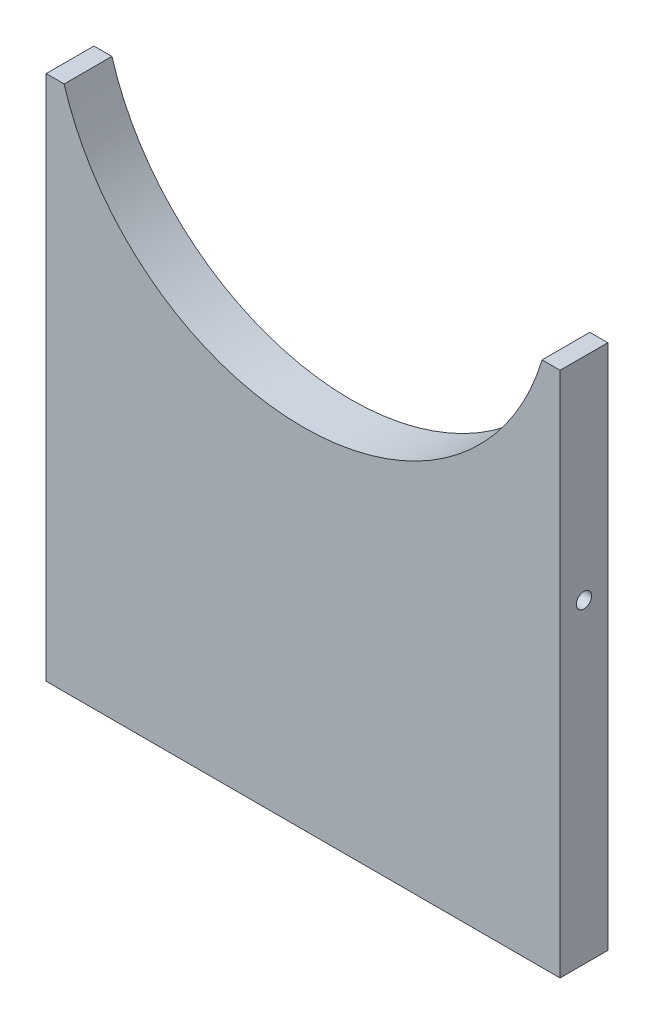
ISO-10303-21;
HEADER;
FILE_DESCRIPTION(('STEP AP214'),'2;1');
FILE_NAME('part.step','',(''),(''),'','','');
FILE_SCHEMA(('AUTOMOTIVE_DESIGN { 1 0 10303 214 1 1 1 1 }'));
ENDSEC;
DATA;
#1=APPLICATION_CONTEXT('core data for automotive mechanical design processes');
#2=APPLICATION_PROTOCOL_DEFINITION('international standard','automotive_design',2000,#1);
#3=PRODUCT_CONTEXT('',#1,'mechanical');
#4=PRODUCT('Part','Part','',(#3));
#5=PRODUCT_RELATED_PRODUCT_CATEGORY('part','',(#4));
#6=PRODUCT_DEFINITION_FORMATION('','',#4);
#7=PRODUCT_DEFINITION_CONTEXT('part definition',#1,'design');
#8=PRODUCT_DEFINITION('design','',#6,#7);
#9=PRODUCT_DEFINITION_SHAPE('','',#8);
#10=(LENGTH_UNIT() NAMED_UNIT(*) SI_UNIT(.MILLI.,.METRE.));
#11=(NAMED_UNIT(*) PLANE_ANGLE_UNIT() SI_UNIT($,.RADIAN.));
#12=(NAMED_UNIT(*) SI_UNIT($,.STERADIAN.) SOLID_ANGLE_UNIT());
#13=UNCERTAINTY_MEASURE_WITH_UNIT(LENGTH_MEASURE(1.E-05),#10,'distance_accuracy_value','');
#14=(GEOMETRIC_REPRESENTATION_CONTEXT(3) GLOBAL_UNCERTAINTY_ASSIGNED_CONTEXT((#13)) GLOBAL_UNIT_ASSIGNED_CONTEXT((#10,
#11,#12)) REPRESENTATION_CONTEXT('',''));
#15=CARTESIAN_POINT('',(0.,0.,0.));
#16=DIRECTION('',(0.,0.,1.));
#17=DIRECTION('',(1.,0.,0.));
#18=AXIS2_PLACEMENT_3D('',#15,#16,#17);
#19=CARTESIAN_POINT('',(0.,0.,12.7));
#20=DIRECTION('',(0.,1.,0.));
#21=DIRECTION('',(0.,0.,1.));
#22=AXIS2_PLACEMENT_3D('',#19,#20,#21);
#23=PLANE('',#22);
#24=CARTESIAN_POINT('',(112.35,0.,6.35));
#25=DIRECTION('',(0.,-1.,0.));
#26=DIRECTION('',(0.,0.,-1.));
#27=AXIS2_PLACEMENT_3D('',#24,#25,#26);
#28=CIRCLE('',#27,2.0193);
#29=CARTESIAN_POINT('',(112.35,0.,4.3307));
#30=VERTEX_POINT('',#29);
#31=EDGE_CURVE('E165',#30,#30,#28,.T.);
#32=ORIENTED_EDGE('',*,*,#31,.F.);
#33=EDGE_LOOP('',(#32));
#34=FACE_BOUND('',#33,.T.);
#35=CARTESIAN_POINT('',(24.35,0.,6.35));
#36=DIRECTION('',(0.,-1.,0.));
#37=DIRECTION('',(0.,0.,-1.));
#38=AXIS2_PLACEMENT_3D('',#35,#36,#37);
#39=CIRCLE('',#38,2.0193);
#40=CARTESIAN_POINT('',(24.35,0.,4.3307));
#41=VERTEX_POINT('',#40);
#42=EDGE_CURVE('E168',#41,#41,#39,.T.);
#43=ORIENTED_EDGE('',*,*,#42,.F.);
#44=EDGE_LOOP('',(#43));
#45=FACE_BOUND('',#44,.T.);
#46=DIRECTION('',(1.,0.,0.));
#47=VECTOR('',#46,1.);
#48=CARTESIAN_POINT('',(0.,0.,0.));
#49=LINE('',#48,#47);
#50=CARTESIAN_POINT('',(0.,0.,0.));
#51=VERTEX_POINT('',#50);
#52=CARTESIAN_POINT('',(136.7,0.,0.));
#53=VERTEX_POINT('',#52);
#54=EDGE_CURVE('E119',#51,#53,#49,.T.);
#55=ORIENTED_EDGE('',*,*,#54,.T.);
#56=DIRECTION('',(0.,0.,-1.));
#57=VECTOR('',#56,1.);
#58=CARTESIAN_POINT('',(136.7,0.,12.7));
#59=LINE('',#58,#57);
#60=CARTESIAN_POINT('',(136.7,0.,12.7));
#61=VERTEX_POINT('',#60);
#62=EDGE_CURVE('E11',#61,#53,#59,.T.);
#63=ORIENTED_EDGE('',*,*,#62,.F.);
#64=DIRECTION('',(1.,0.,0.));
#65=VECTOR('',#64,1.);
#66=CARTESIAN_POINT('',(0.,0.,12.7));
#67=LINE('',#66,#65);
#68=CARTESIAN_POINT('',(0.,0.,12.7));
#69=VERTEX_POINT('',#68);
#70=EDGE_CURVE('E130',#69,#61,#67,.T.);
#71=ORIENTED_EDGE('',*,*,#70,.F.);
#72=DIRECTION('',(0.,0.,-1.));
#73=VECTOR('',#72,1.);
#74=CARTESIAN_POINT('',(0.,0.,12.7));
#75=LINE('',#74,#73);
#76=EDGE_CURVE('E115',#69,#51,#75,.T.);
#77=ORIENTED_EDGE('',*,*,#76,.T.);
#78=EDGE_LOOP('',(#55,#63,#71,#77));
#79=FACE_BOUND('',#78,.T.);
#80=ADVANCED_FACE('F32',(#34,#45,#79),#23,.F.);
#81=CARTESIAN_POINT('',(136.7,0.,12.7));
#82=DIRECTION('',(-1.,0.,0.));
#83=DIRECTION('',(0.,0.,1.));
#84=AXIS2_PLACEMENT_3D('',#81,#82,#83);
#85=PLANE('',#84);
#86=CARTESIAN_POINT('',(136.7,83.866,6.34999999999999));
#87=DIRECTION('',(1.,0.,0.));
#88=DIRECTION('',(0.,0.,-1.));
#89=AXIS2_PLACEMENT_3D('',#86,#87,#88);
#90=CIRCLE('',#89,2.0193);
#91=CARTESIAN_POINT('',(136.7,83.866,4.33069999999999));
#92=VERTEX_POINT('',#91);
#93=EDGE_CURVE('E185',#92,#92,#90,.T.);
#94=ORIENTED_EDGE('',*,*,#93,.F.);
#95=EDGE_LOOP('',(#94));
#96=FACE_BOUND('',#95,.T.);
#97=DIRECTION('',(0.,1.,0.));
#98=VECTOR('',#97,1.);
#99=CARTESIAN_POINT('',(136.7,0.,0.));
#100=LINE('',#99,#98);
#101=CARTESIAN_POINT('',(136.7,140.,0.));
#102=VERTEX_POINT('',#101);
#103=EDGE_CURVE('E122',#53,#102,#100,.T.);
#104=ORIENTED_EDGE('',*,*,#103,.T.);
#105=DIRECTION('',(0.,0.,-1.));
#106=VECTOR('',#105,1.);
#107=CARTESIAN_POINT('',(136.7,140.,12.7));
#108=LINE('',#107,#106);
#109=CARTESIAN_POINT('',(136.7,140.,12.7));
#110=VERTEX_POINT('',#109);
#111=EDGE_CURVE('E40',#110,#102,#108,.T.);
#112=ORIENTED_EDGE('',*,*,#111,.F.);
#113=DIRECTION('',(0.,1.,0.));
#114=VECTOR('',#113,1.);
#115=CARTESIAN_POINT('',(136.7,0.,12.7));
#116=LINE('',#115,#114);
#117=EDGE_CURVE('E86',#61,#110,#116,.T.);
#118=ORIENTED_EDGE('',*,*,#117,.F.);
#119=ORIENTED_EDGE('',*,*,#62,.T.);
#120=EDGE_LOOP('',(#104,#112,#118,#119));
#121=FACE_BOUND('',#120,.T.);
#122=ADVANCED_FACE('F156',(#96,#121),#85,.F.);
#123=CARTESIAN_POINT('',(131.913581570094,140.,12.7));
#124=DIRECTION('',(0.,-1.,0.));
#125=DIRECTION('',(0.,0.,-1.));
#126=AXIS2_PLACEMENT_3D('',#123,#124,#125);
#127=PLANE('',#126);
#128=DIRECTION('',(-1.,0.,0.));
#129=VECTOR('',#128,1.);
#130=CARTESIAN_POINT('',(131.913581570094,140.,0.));
#131=LINE('',#130,#129);
#132=CARTESIAN_POINT('',(131.913581570094,140.,0.));
#133=VERTEX_POINT('',#132);
#134=EDGE_CURVE('E125',#102,#133,#131,.T.);
#135=ORIENTED_EDGE('',*,*,#134,.T.);
#136=DIRECTION('',(0.,0.,-1.));
#137=VECTOR('',#136,1.);
#138=CARTESIAN_POINT('',(131.913581570094,140.,12.7));
#139=LINE('',#138,#137);
#140=CARTESIAN_POINT('',(131.913581570094,140.,12.7));
#141=VERTEX_POINT('',#140);
#142=EDGE_CURVE('E110',#141,#133,#139,.T.);
#143=ORIENTED_EDGE('',*,*,#142,.F.);
#144=DIRECTION('',(-1.,0.,0.));
#145=VECTOR('',#144,1.);
#146=CARTESIAN_POINT('',(131.913581570094,140.,12.7));
#147=LINE('',#146,#145);
#148=EDGE_CURVE('E101',#110,#141,#147,.T.);
#149=ORIENTED_EDGE('',*,*,#148,.F.);
#150=ORIENTED_EDGE('',*,*,#111,.T.);
#151=EDGE_LOOP('',(#135,#143,#149,#150));
#152=FACE_BOUND('',#151,.T.);
#153=ADVANCED_FACE('F136',(#152),#127,.F.);
#154=CARTESIAN_POINT('',(68.35,159.095758638552,12.7));
#155=DIRECTION('',(0.,0.,-1.));
#156=DIRECTION('',(-1.,0.,0.));
#157=AXIS2_PLACEMENT_3D('',#154,#155,#156);
#158=CYLINDRICAL_SURFACE('',#157,66.3699999999986);
#159=CARTESIAN_POINT('',(68.35,159.095758638552,0.));
#160=DIRECTION('',(0.,0.,-1.));
#161=DIRECTION('',(1.,0.,0.));
#162=AXIS2_PLACEMENT_3D('',#159,#160,#161);
#163=CIRCLE('',#162,66.3699999999986);
#164=CARTESIAN_POINT('',(4.78641842990615,140.,0.));
#165=VERTEX_POINT('',#164);
#166=EDGE_CURVE('E109',#133,#165,#163,.T.);
#167=ORIENTED_EDGE('',*,*,#166,.T.);
#168=DIRECTION('',(0.,0.,-1.));
#169=VECTOR('',#168,1.);
#170=CARTESIAN_POINT('',(4.78641842990615,140.,12.7));
#171=LINE('',#170,#169);
#172=CARTESIAN_POINT('',(4.78641842990615,140.,12.7));
#173=VERTEX_POINT('',#172);
#174=EDGE_CURVE('E106',#173,#165,#171,.T.);
#175=ORIENTED_EDGE('',*,*,#174,.F.);
#176=CARTESIAN_POINT('',(68.35,159.095758638552,12.7));
#177=DIRECTION('',(0.,0.,-1.));
#178=DIRECTION('',(1.,0.,0.));
#179=AXIS2_PLACEMENT_3D('',#176,#177,#178);
#180=CIRCLE('',#179,66.3699999999986);
#181=EDGE_CURVE('E95',#141,#173,#180,.T.);
#182=ORIENTED_EDGE('',*,*,#181,.F.);
#183=ORIENTED_EDGE('',*,*,#142,.T.);
#184=EDGE_LOOP('',(#167,#175,#182,#183));
#185=FACE_BOUND('',#184,.T.);
#186=ADVANCED_FACE('F107',(#185),#158,.F.);
#187=CARTESIAN_POINT('',(0.,140.,12.7));
#188=DIRECTION('',(0.,-1.,0.));
#189=DIRECTION('',(0.,0.,-1.));
#190=AXIS2_PLACEMENT_3D('',#187,#188,#189);
#191=PLANE('',#190);
#192=DIRECTION('',(-1.,0.,0.));
#193=VECTOR('',#192,1.);
#194=CARTESIAN_POINT('',(0.,140.,0.));
#195=LINE('',#194,#193);
#196=CARTESIAN_POINT('',(0.,140.,0.));
#197=VERTEX_POINT('',#196);
#198=EDGE_CURVE('E72',#165,#197,#195,.T.);
#199=ORIENTED_EDGE('',*,*,#198,.T.);
#200=DIRECTION('',(0.,0.,-1.));
#201=VECTOR('',#200,1.);
#202=CARTESIAN_POINT('',(0.,140.,12.7));
#203=LINE('',#202,#201);
#204=CARTESIAN_POINT('',(0.,140.,12.7));
#205=VERTEX_POINT('',#204);
#206=EDGE_CURVE('E111',#205,#197,#203,.T.);
#207=ORIENTED_EDGE('',*,*,#206,.F.);
#208=DIRECTION('',(-1.,0.,0.));
#209=VECTOR('',#208,1.);
#210=CARTESIAN_POINT('',(0.,140.,12.7));
#211=LINE('',#210,#209);
#212=EDGE_CURVE('E99',#173,#205,#211,.T.);
#213=ORIENTED_EDGE('',*,*,#212,.F.);
#214=ORIENTED_EDGE('',*,*,#174,.T.);
#215=EDGE_LOOP('',(#199,#207,#213,#214));
#216=FACE_BOUND('',#215,.T.);
#217=ADVANCED_FACE('F113',(#216),#191,.F.);
#218=CARTESIAN_POINT('',(0.,0.,12.7));
#219=DIRECTION('',(1.,0.,0.));
#220=DIRECTION('',(0.,0.,-1.));
#221=AXIS2_PLACEMENT_3D('',#218,#219,#220);
#222=PLANE('',#221);
#223=CARTESIAN_POINT('',(-3.05339327197747E-13,83.8659999999998,6.34999999999999));
#224=DIRECTION('',(-1.,0.,0.));
#225=DIRECTION('',(0.,0.,1.));
#226=AXIS2_PLACEMENT_3D('',#223,#224,#225);
#227=CIRCLE('',#226,2.0193);
#228=CARTESIAN_POINT('',(-3.05339327197747E-13,83.8659999999998,8.36929999999999));
#229=VERTEX_POINT('',#228);
#230=EDGE_CURVE('E174',#229,#229,#227,.T.);
#231=ORIENTED_EDGE('',*,*,#230,.F.);
#232=EDGE_LOOP('',(#231));
#233=FACE_BOUND('',#232,.T.);
#234=DIRECTION('',(0.,-1.,0.));
#235=VECTOR('',#234,1.);
#236=CARTESIAN_POINT('',(0.,0.,0.));
#237=LINE('',#236,#235);
#238=EDGE_CURVE('E78',#197,#51,#237,.T.);
#239=ORIENTED_EDGE('',*,*,#238,.T.);
#240=ORIENTED_EDGE('',*,*,#76,.F.);
#241=DIRECTION('',(0.,-1.,0.));
#242=VECTOR('',#241,1.);
#243=CARTESIAN_POINT('',(0.,0.,12.7));
#244=LINE('',#243,#242);
#245=EDGE_CURVE('E48',#205,#69,#244,.T.);
#246=ORIENTED_EDGE('',*,*,#245,.F.);
#247=ORIENTED_EDGE('',*,*,#206,.T.);
#248=EDGE_LOOP('',(#239,#240,#246,#247));
#249=FACE_BOUND('',#248,.T.);
#250=ADVANCED_FACE('F143',(#233,#249),#222,.F.);
#251=CARTESIAN_POINT('',(68.35,159.095758638552,12.7));
#252=DIRECTION('',(0.,0.,1.));
#253=DIRECTION('',(1.,0.,0.));
#254=AXIS2_PLACEMENT_3D('',#251,#252,#253);
#255=PLANE('',#254);
#256=ORIENTED_EDGE('',*,*,#70,.T.);
#257=ORIENTED_EDGE('',*,*,#117,.T.);
#258=ORIENTED_EDGE('',*,*,#148,.T.);
#259=ORIENTED_EDGE('',*,*,#181,.T.);
#260=ORIENTED_EDGE('',*,*,#212,.T.);
#261=ORIENTED_EDGE('',*,*,#245,.T.);
#262=EDGE_LOOP('',(#256,#257,#258,#259,#260,#261));
#263=FACE_BOUND('',#262,.T.);
#264=ADVANCED_FACE('F97',(#263),#255,.T.);
#265=CARTESIAN_POINT('',(68.35,159.095758638552,0.));
#266=DIRECTION('',(0.,0.,1.));
#267=DIRECTION('',(1.,0.,0.));
#268=AXIS2_PLACEMENT_3D('',#265,#266,#267);
#269=PLANE('',#268);
#270=ORIENTED_EDGE('',*,*,#54,.F.);
#271=ORIENTED_EDGE('',*,*,#238,.F.);
#272=ORIENTED_EDGE('',*,*,#198,.F.);
#273=ORIENTED_EDGE('',*,*,#166,.F.);
#274=ORIENTED_EDGE('',*,*,#134,.F.);
#275=ORIENTED_EDGE('',*,*,#103,.F.);
#276=EDGE_LOOP('',(#270,#271,#272,#273,#274,#275));
#277=FACE_BOUND('',#276,.T.);
#278=ADVANCED_FACE('F139',(#277),#269,.F.);
#279=CARTESIAN_POINT('',(111.3,83.866,6.34999999999999));
#280=DIRECTION('',(1.,0.,0.));
#281=DIRECTION('',(0.,0.,-1.));
#282=AXIS2_PLACEMENT_3D('',#279,#280,#281);
#283=CONICAL_SURFACE('',#282,2.0193,1.02974425867665);
#284=CARTESIAN_POINT('',(110.086682151998,83.866,6.34999999999999));
#285=VERTEX_POINT('',#284);
#286=VERTEX_LOOP('',#285);
#287=FACE_BOUND('',#286,.T.);
#288=CARTESIAN_POINT('',(111.3,83.866,6.34999999999999));
#289=DIRECTION('',(1.,0.,0.));
#290=DIRECTION('',(0.,0.,-1.));
#291=AXIS2_PLACEMENT_3D('',#288,#289,#290);
#292=CIRCLE('',#291,2.0193);
#293=CARTESIAN_POINT('',(111.3,83.866,4.33069999999999));
#294=VERTEX_POINT('',#293);
#295=EDGE_CURVE('E123',#294,#294,#292,.T.);
#296=ORIENTED_EDGE('',*,*,#295,.T.);
#297=EDGE_LOOP('',(#296));
#298=FACE_BOUND('',#297,.T.);
#299=ADVANCED_FACE('F193',(#287,#298),#283,.F.);
#300=CARTESIAN_POINT('',(136.7,83.866,6.34999999999999));
#301=DIRECTION('',(1.,0.,0.));
#302=DIRECTION('',(0.,0.,-1.));
#303=AXIS2_PLACEMENT_3D('',#300,#301,#302);
#304=CYLINDRICAL_SURFACE('',#303,2.0193);
#305=ORIENTED_EDGE('',*,*,#295,.F.);
#306=EDGE_LOOP('',(#305));
#307=FACE_BOUND('',#306,.T.);
#308=ORIENTED_EDGE('',*,*,#93,.T.);
#309=EDGE_LOOP('',(#308));
#310=FACE_BOUND('',#309,.T.);
#311=ADVANCED_FACE('F195',(#307,#310),#304,.F.);
#312=CARTESIAN_POINT('',(25.3999999999997,83.8659999999998,6.34999999999999));
#313=DIRECTION('',(-1.,0.,0.));
#314=DIRECTION('',(0.,0.,1.));
#315=AXIS2_PLACEMENT_3D('',#312,#313,#314);
#316=CONICAL_SURFACE('',#315,2.0193,1.02974425867665);
#317=CARTESIAN_POINT('',(26.6133178480021,83.8659999999998,6.34999999999999));
#318=VERTEX_POINT('',#317);
#319=VERTEX_LOOP('',#318);
#320=FACE_BOUND('',#319,.T.);
#321=CARTESIAN_POINT('',(25.3999999999997,83.8659999999998,6.34999999999999));
#322=DIRECTION('',(-1.,0.,0.));
#323=DIRECTION('',(0.,0.,1.));
#324=AXIS2_PLACEMENT_3D('',#321,#322,#323);
#325=CIRCLE('',#324,2.0193);
#326=CARTESIAN_POINT('',(25.3999999999997,83.8659999999998,8.36929999999999));
#327=VERTEX_POINT('',#326);
#328=EDGE_CURVE('E182',#327,#327,#325,.T.);
#329=ORIENTED_EDGE('',*,*,#328,.T.);
#330=EDGE_LOOP('',(#329));
#331=FACE_BOUND('',#330,.T.);
#332=ADVANCED_FACE('F198',(#320,#331),#316,.F.);
#333=CARTESIAN_POINT('',(-3.05311331771918E-13,83.8659999999998,6.34999999999999));
#334=DIRECTION('',(-1.,0.,0.));
#335=DIRECTION('',(0.,0.,1.));
#336=AXIS2_PLACEMENT_3D('',#333,#334,#335);
#337=CYLINDRICAL_SURFACE('',#336,2.0193);
#338=ORIENTED_EDGE('',*,*,#328,.F.);
#339=EDGE_LOOP('',(#338));
#340=FACE_BOUND('',#339,.T.);
#341=ORIENTED_EDGE('',*,*,#230,.T.);
#342=EDGE_LOOP('',(#341));
#343=FACE_BOUND('',#342,.T.);
#344=ADVANCED_FACE('F205',(#340,#343),#337,.F.);
#345=CARTESIAN_POINT('',(24.35,25.4,6.35));
#346=DIRECTION('',(0.,-1.,0.));
#347=DIRECTION('',(0.,0.,-1.));
#348=AXIS2_PLACEMENT_3D('',#345,#346,#347);
#349=CONICAL_SURFACE('',#348,2.01929999999999,1.02974425867665);
#350=CARTESIAN_POINT('',(24.35,26.6133178480024,6.35));
#351=VERTEX_POINT('',#350);
#352=VERTEX_LOOP('',#351);
#353=FACE_BOUND('',#352,.T.);
#354=CARTESIAN_POINT('',(24.35,25.4,6.35));
#355=DIRECTION('',(0.,-1.,0.));
#356=DIRECTION('',(0.,0.,-1.));
#357=AXIS2_PLACEMENT_3D('',#354,#355,#356);
#358=CIRCLE('',#357,2.01929999999999);
#359=CARTESIAN_POINT('',(24.35,25.4,4.3307));
#360=VERTEX_POINT('',#359);
#361=EDGE_CURVE('E170',#360,#360,#358,.T.);
#362=ORIENTED_EDGE('',*,*,#361,.T.);
#363=EDGE_LOOP('',(#362));
#364=FACE_BOUND('',#363,.T.);
#365=ADVANCED_FACE('F247',(#353,#364),#349,.F.);
#366=CARTESIAN_POINT('',(24.35,0.,6.35));
#367=DIRECTION('',(0.,-1.,0.));
#368=DIRECTION('',(0.,0.,-1.));
#369=AXIS2_PLACEMENT_3D('',#366,#367,#368);
#370=CYLINDRICAL_SURFACE('',#369,2.0193);
#371=ORIENTED_EDGE('',*,*,#361,.F.);
#372=EDGE_LOOP('',(#371));
#373=FACE_BOUND('',#372,.T.);
#374=ORIENTED_EDGE('',*,*,#42,.T.);
#375=EDGE_LOOP('',(#374));
#376=FACE_BOUND('',#375,.T.);
#377=ADVANCED_FACE('F261',(#373,#376),#370,.F.);
#378=CARTESIAN_POINT('',(112.35,25.4,6.35));
#379=DIRECTION('',(0.,-1.,0.));
#380=DIRECTION('',(0.,0.,-1.));
#381=AXIS2_PLACEMENT_3D('',#378,#379,#380);
#382=CONICAL_SURFACE('',#381,2.0193,1.02974425867665);
#383=CARTESIAN_POINT('',(112.35,26.6133178480024,6.35));
#384=VERTEX_POINT('',#383);
#385=VERTEX_LOOP('',#384);
#386=FACE_BOUND('',#385,.T.);
#387=CARTESIAN_POINT('',(112.35,25.4,6.35));
#388=DIRECTION('',(0.,-1.,0.));
#389=DIRECTION('',(0.,0.,-1.));
#390=AXIS2_PLACEMENT_3D('',#387,#388,#389);
#391=CIRCLE('',#390,2.0193);
#392=CARTESIAN_POINT('',(112.35,25.4,4.3307));
#393=VERTEX_POINT('',#392);
#394=EDGE_CURVE('E171',#393,#393,#391,.T.);
#395=ORIENTED_EDGE('',*,*,#394,.T.);
#396=EDGE_LOOP('',(#395));
#397=FACE_BOUND('',#396,.T.);
#398=ADVANCED_FACE('F271',(#386,#397),#382,.F.);
#399=CARTESIAN_POINT('',(112.35,0.,6.35));
#400=DIRECTION('',(0.,-1.,0.));
#401=DIRECTION('',(0.,0.,-1.));
#402=AXIS2_PLACEMENT_3D('',#399,#400,#401);
#403=CYLINDRICAL_SURFACE('',#402,2.0193);
#404=ORIENTED_EDGE('',*,*,#394,.F.);
#405=EDGE_LOOP('',(#404));
#406=FACE_BOUND('',#405,.T.);
#407=ORIENTED_EDGE('',*,*,#31,.T.);
#408=EDGE_LOOP('',(#407));
#409=FACE_BOUND('',#408,.T.);
#410=ADVANCED_FACE('F281',(#406,#409),#403,.F.);
#411=CLOSED_SHELL('',(#80,#122,#153,#186,#217,#250,#264,#278,#299,#311,#332,#344,#365,#377,#398,#410));
#412=MANIFOLD_SOLID_BREP('B2',#411);
#413=ADVANCED_BREP_SHAPE_REPRESENTATION('',(#18,#412),#14);
#414=SHAPE_DEFINITION_REPRESENTATION(#9,#413);
ENDSEC;
END-ISO-10303-21;
